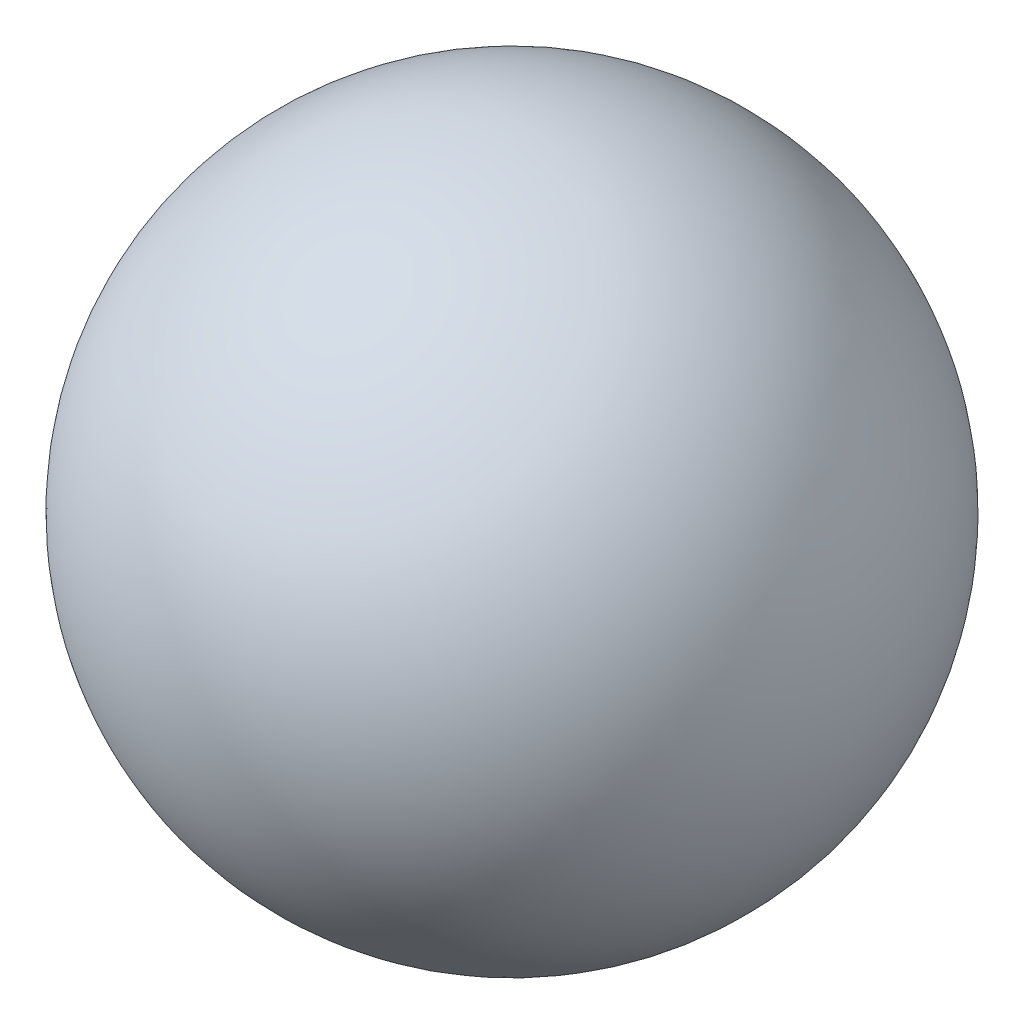
ISO-10303-21;
HEADER;
FILE_DESCRIPTION(('STEP AP214'),'2;1');
FILE_NAME('part.step','',(''),(''),'','','');
FILE_SCHEMA(('AUTOMOTIVE_DESIGN { 1 0 10303 214 1 1 1 1 }'));
ENDSEC;
DATA;
#1=APPLICATION_CONTEXT('core data for automotive mechanical design processes');
#2=APPLICATION_PROTOCOL_DEFINITION('international standard','automotive_design',2000,#1);
#3=PRODUCT_CONTEXT('',#1,'mechanical');
#4=PRODUCT('Part','Part','',(#3));
#5=PRODUCT_RELATED_PRODUCT_CATEGORY('part','',(#4));
#6=PRODUCT_DEFINITION_FORMATION('','',#4);
#7=PRODUCT_DEFINITION_CONTEXT('part definition',#1,'design');
#8=PRODUCT_DEFINITION('design','',#6,#7);
#9=PRODUCT_DEFINITION_SHAPE('','',#8);
#10=(LENGTH_UNIT() NAMED_UNIT(*) SI_UNIT(.MILLI.,.METRE.));
#11=(NAMED_UNIT(*) PLANE_ANGLE_UNIT() SI_UNIT($,.RADIAN.));
#12=(NAMED_UNIT(*) SI_UNIT($,.STERADIAN.) SOLID_ANGLE_UNIT());
#13=UNCERTAINTY_MEASURE_WITH_UNIT(LENGTH_MEASURE(1.E-05),#10,'distance_accuracy_value','');
#14=(GEOMETRIC_REPRESENTATION_CONTEXT(3) GLOBAL_UNCERTAINTY_ASSIGNED_CONTEXT((#13)) GLOBAL_UNIT_ASSIGNED_CONTEXT((#10,
#11,#12)) REPRESENTATION_CONTEXT('',''));
#15=CARTESIAN_POINT('',(0.,0.,0.));
#16=DIRECTION('',(0.,0.,1.));
#17=DIRECTION('',(1.,0.,0.));
#18=AXIS2_PLACEMENT_3D('',#15,#16,#17);
#19=CARTESIAN_POINT('',(0.,0.,0.));
#20=DIRECTION('',(0.,0.,-1.));
#21=DIRECTION('',(-1.,0.,0.));
#22=AXIS2_PLACEMENT_3D('',#19,#20,#21);
#23=SPHERICAL_SURFACE('',#22,34.25);
#24=CARTESIAN_POINT('',(0.,0.,-34.25));
#25=VERTEX_POINT('',#24);
#26=VERTEX_LOOP('',#25);
#27=FACE_BOUND('',#26,.T.);
#28=ADVANCED_FACE('F38',(#27),#23,.T.);
#29=CLOSED_SHELL('',(#28));
#30=MANIFOLD_SOLID_BREP('B2',#29);
#31=ADVANCED_BREP_SHAPE_REPRESENTATION('',(#18,#30),#14);
#32=SHAPE_DEFINITION_REPRESENTATION(#9,#31);
ENDSEC;
END-ISO-10303-21;
